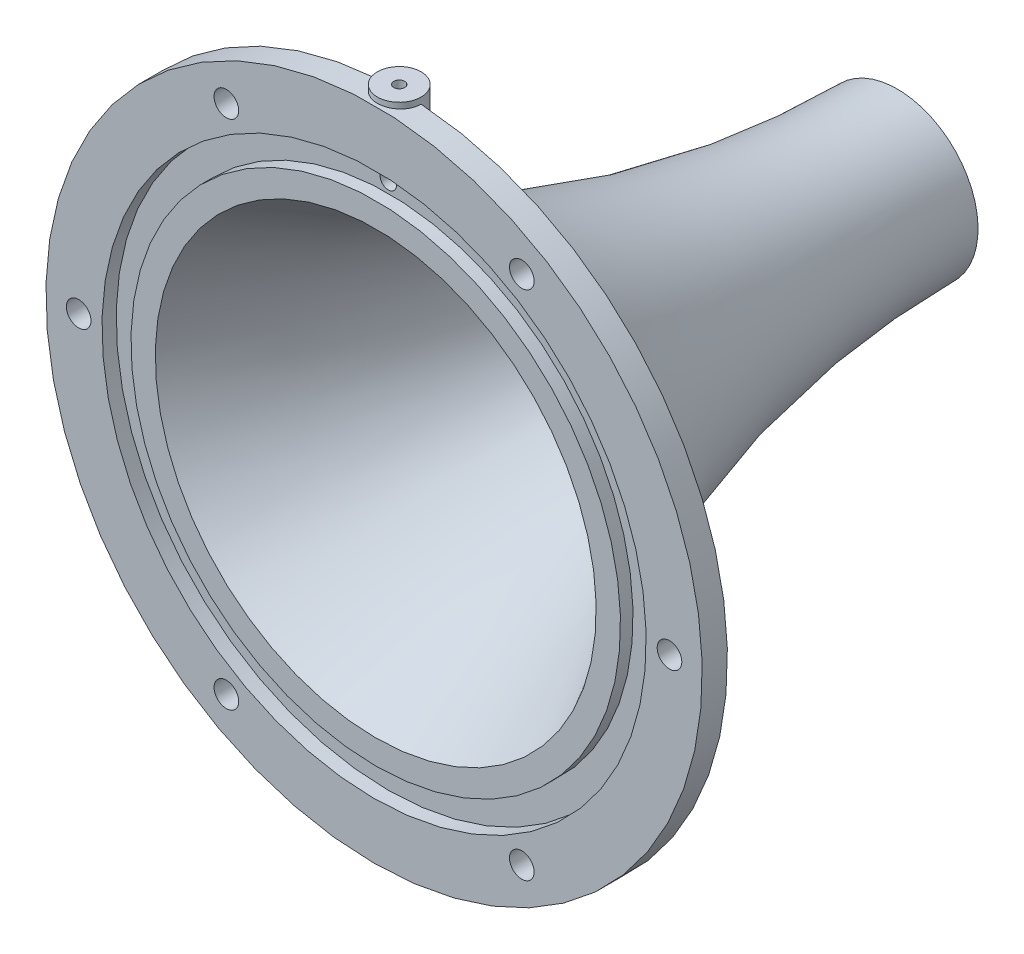
ISO-10303-21;
HEADER;
FILE_DESCRIPTION(('STEP AP214'),'2;1');
FILE_NAME('part.step','',(''),(''),'','','');
FILE_SCHEMA(('AUTOMOTIVE_DESIGN { 1 0 10303 214 1 1 1 1 }'));
ENDSEC;
DATA;
#1=APPLICATION_CONTEXT('core data for automotive mechanical design processes');
#2=APPLICATION_PROTOCOL_DEFINITION('international standard','automotive_design',2000,#1);
#3=PRODUCT_CONTEXT('',#1,'mechanical');
#4=PRODUCT('Part','Part','',(#3));
#5=PRODUCT_RELATED_PRODUCT_CATEGORY('part','',(#4));
#6=PRODUCT_DEFINITION_FORMATION('','',#4);
#7=PRODUCT_DEFINITION_CONTEXT('part definition',#1,'design');
#8=PRODUCT_DEFINITION('design','',#6,#7);
#9=PRODUCT_DEFINITION_SHAPE('','',#8);
#10=(LENGTH_UNIT() NAMED_UNIT(*) SI_UNIT(.MILLI.,.METRE.));
#11=(NAMED_UNIT(*) PLANE_ANGLE_UNIT() SI_UNIT($,.RADIAN.));
#12=(NAMED_UNIT(*) SI_UNIT($,.STERADIAN.) SOLID_ANGLE_UNIT());
#13=UNCERTAINTY_MEASURE_WITH_UNIT(LENGTH_MEASURE(1.E-05),#10,'distance_accuracy_value','');
#14=(GEOMETRIC_REPRESENTATION_CONTEXT(3) GLOBAL_UNCERTAINTY_ASSIGNED_CONTEXT((#13)) GLOBAL_UNIT_ASSIGNED_CONTEXT((#10,
#11,#12)) REPRESENTATION_CONTEXT('',''));
#15=CARTESIAN_POINT('',(0.,0.,0.));
#16=DIRECTION('',(0.,0.,1.));
#17=DIRECTION('',(1.,0.,0.));
#18=AXIS2_PLACEMENT_3D('',#15,#16,#17);
#19=CARTESIAN_POINT('',(3.11633262842919E-13,47.,-4.25000000000002));
#20=DIRECTION('',(0.,1.,0.));
#21=DIRECTION('',(-1.,0.,0.));
#22=AXIS2_PLACEMENT_3D('',#19,#20,#21);
#23=CYLINDRICAL_SURFACE('',#22,1.);
#24=CARTESIAN_POINT('',(4.09394740330526E-13,61.,-4.25000000000002));
#25=DIRECTION('',(0.,1.,0.));
#26=DIRECTION('',(-1.,0.,0.));
#27=AXIS2_PLACEMENT_3D('',#24,#25,#26);
#28=CIRCLE('',#27,1.);
#29=CARTESIAN_POINT('',(-0.999999999999591,61.,-4.25000000000002));
#30=VERTEX_POINT('',#29);
#31=EDGE_CURVE('E100',#30,#30,#28,.T.);
#32=ORIENTED_EDGE('',*,*,#31,.T.);
#33=EDGE_LOOP('',(#32));
#34=FACE_BOUND('',#33,.T.);
#35=DIRECTION('',(0.,1.,0.));
#36=VECTOR('',#35,1.);
#37=CARTESIAN_POINT('',(0.312249899920286,47.,-5.2));
#38=LINE('',#37,#36);
#39=CARTESIAN_POINT('',(0.312249899920295,48.2645090409801,-5.2));
#40=VERTEX_POINT('',#39);
#41=CARTESIAN_POINT('',(0.312249899920286,47.,-5.2));
#42=VERTEX_POINT('',#41);
#43=EDGE_CURVE('E58',#40,#42,#38,.F.);
#44=ORIENTED_EDGE('',*,*,#43,.F.);
#45=CARTESIAN_POINT('',(0.312249899920295,48.2645090409801,-5.2));
#46=CARTESIAN_POINT('',(0.339429131130015,48.2587272483234,-5.19106721556151));
#47=CARTESIAN_POINT('',(0.366069367138822,48.252264916611,-5.18101786271158));
#48=CARTESIAN_POINT('',(0.418112167071895,48.2381697059591,-5.1588352082007));
#49=CARTESIAN_POINT('',(0.443516010642875,48.2305380727019,-5.1467041226239));
#50=CARTESIAN_POINT('',(0.517371581503358,48.2062676755095,-5.10756341100762));
#51=CARTESIAN_POINT('',(0.563851831613718,48.1881671398485,-5.07767706124185));
#52=CARTESIAN_POINT('',(0.650514545487215,48.1498014218964,-5.0114466868769));
#53=CARTESIAN_POINT('',(0.690721276479891,48.1295451175943,-4.97512876755921));
#54=CARTESIAN_POINT('',(0.764793783944427,48.0884495534347,-4.89654026336707));
#55=CARTESIAN_POINT('',(0.7986375661415,48.0676085476949,-4.85424988493833));
#56=CARTESIAN_POINT('',(0.86257720134162,48.0252045811346,-4.75948259884957));
#57=CARTESIAN_POINT('',(0.891890965614326,48.0038008004243,-4.70640059428819));
#58=CARTESIAN_POINT('',(0.940807440682571,47.9660616521264,-4.59435951943732));
#59=CARTESIAN_POINT('',(0.960446486497765,47.9497074079348,-4.53542345340502));
#60=CARTESIAN_POINT('',(0.984018988756187,47.9295631538378,-4.43304548253065));
#61=CARTESIAN_POINT('',(0.990978413505443,47.9234198049856,-4.39076264043626));
#62=CARTESIAN_POINT('',(0.999393306873638,47.9159607281361,-4.30524865317566));
#63=CARTESIAN_POINT('',(1.00085513268926,47.9146394241774,-4.26201866149978));
#64=CARTESIAN_POINT('',(0.998180501694661,47.9170286656982,-4.1758803518083));
#65=CARTESIAN_POINT('',(0.994043862852669,47.9207393747914,-4.13297204429774));
#66=CARTESIAN_POINT('',(0.980448018815304,47.9326224303053,-4.04862283178369));
#67=CARTESIAN_POINT('',(0.970981356266491,47.9408010273686,-4.00718406938978));
#68=CARTESIAN_POINT('',(0.943769474548862,47.9634276932872,-3.91499593542304));
#69=CARTESIAN_POINT('',(0.924425688527903,47.9790027536465,-3.86499986539942));
#70=CARTESIAN_POINT('',(0.878650580734091,48.0134248937674,-3.76960080759542));
#71=CARTESIAN_POINT('',(0.85220921618486,48.032276596414,-3.72420445457389));
#72=CARTESIAN_POINT('',(0.792353832748401,48.0715274584364,-3.63763333862915));
#73=CARTESIAN_POINT('',(0.758821541362462,48.0919485555119,-3.5965505714794));
#74=CARTESIAN_POINT('',(0.685528032516043,48.1322102837797,-3.52002819528285));
#75=CARTESIAN_POINT('',(0.645765555927867,48.1520507966712,-3.48458972988182));
#76=CARTESIAN_POINT('',(0.554899862045546,48.1919484678116,-3.41589492767503));
#77=CARTESIAN_POINT('',(0.502995611991148,48.2117044646022,-3.38350737394361));
#78=CARTESIAN_POINT('',(0.39278622750259,48.2461742130727,-3.32831620009406));
#79=CARTESIAN_POINT('',(0.334488972569568,48.2608940816597,-3.30550094573106));
#80=CARTESIAN_POINT('',(0.22131802490095,48.2819182257329,-3.27326353785595));
#81=CARTESIAN_POINT('',(0.166992333140664,48.2890708118812,-3.26248090007744));
#82=CARTESIAN_POINT('',(0.0568702512554773,48.2973030547209,-3.25008719867515));
#83=CARTESIAN_POINT('',(0.00107547948069877,48.2983891344525,-3.24846643470464));
#84=CARTESIAN_POINT('',(-0.10192810790048,48.2946627669567,-3.25406327138851));
#85=CARTESIAN_POINT('',(-0.149239451532032,48.2906595078044,-3.26006825169875));
#86=CARTESIAN_POINT('',(-0.242005610189204,48.2784568970987,-3.27857321359998));
#87=CARTESIAN_POINT('',(-0.287460209609515,48.2702570597254,-3.29107394717898));
#88=CARTESIAN_POINT('',(-0.376151268655612,48.2501637651787,-3.3222304184781));
#89=CARTESIAN_POINT('',(-0.419341774893449,48.2382144105505,-3.34097958905729));
#90=CARTESIAN_POINT('',(-0.501998423589624,48.2115423022087,-3.38387753227945));
#91=CARTESIAN_POINT('',(-0.541463788321321,48.1968189712645,-3.40802742894352));
#92=CARTESIAN_POINT('',(-0.621503193572179,48.1633375726543,-3.46484324292302));
#93=CARTESIAN_POINT('',(-0.661449342720923,48.1443033170389,-3.49822972755308));
#94=CARTESIAN_POINT('',(-0.735549561683111,48.1053157948276,-3.57054908910779));
#95=CARTESIAN_POINT('',(-0.769693259531983,48.0853609619556,-3.60949167382677));
#96=CARTESIAN_POINT('',(-0.836292320786411,48.0433141885819,-3.698506233676));
#97=CARTESIAN_POINT('',(-0.867767994760641,48.0213372939862,-3.74937287981356));
#98=CARTESIAN_POINT('',(-0.921557828450619,47.9813692999093,-3.85714338666404));
#99=CARTESIAN_POINT('',(-0.943893699505366,47.9633688020171,-3.91403253128541));
#100=CARTESIAN_POINT('',(-0.97280948904171,47.9392454652403,-4.01447210623816));
#101=CARTESIAN_POINT('',(-0.982120484046534,47.931173066213,-4.05676489724562));
#102=CARTESIAN_POINT('',(-0.995184540809722,47.9197263908964,-4.14279399674645));
#103=CARTESIAN_POINT('',(-0.998946628039302,47.9163444859086,-4.18652784257669));
#104=CARTESIAN_POINT('',(-1.00066992897141,47.9148043267936,-4.27431052310508));
#105=CARTESIAN_POINT('',(-0.99861736516637,47.9166584791942,-4.31835985883185));
#106=CARTESIAN_POINT('',(-0.988831822566293,47.9253101301408,-4.40534918998823));
#107=CARTESIAN_POINT('',(-0.98109150462051,47.9321140154241,-4.44828767786996));
#108=CARTESIAN_POINT('',(-0.958188311089447,47.951554028771,-4.5408724069241));
#109=CARTESIAN_POINT('',(-0.941801291013707,47.9651196900877,-4.59001517858134));
#110=CARTESIAN_POINT('',(-0.902251884525741,47.9959377219145,-4.68423795256894));
#111=CARTESIAN_POINT('',(-0.879080139267191,48.013195175964,-4.72931222970512));
#112=CARTESIAN_POINT('',(-0.826181536914572,48.0497572823741,-4.81571569887383));
#113=CARTESIAN_POINT('',(-0.796347078372984,48.0690924714234,-4.85696556335929));
#114=CARTESIAN_POINT('',(-0.730806457519254,48.1078542198448,-4.93446855323348));
#115=CARTESIAN_POINT('',(-0.695098820106323,48.127280800977,-4.97072041911525));
#116=CARTESIAN_POINT('',(-0.616402170640292,48.1655989429746,-5.0392367690365));
#117=CARTESIAN_POINT('',(-0.573154436716379,48.1844251710129,-5.07124233844544));
#118=CARTESIAN_POINT('',(-0.481226185532255,48.2189212428746,-5.12825217263113));
#119=CARTESIAN_POINT('',(-0.432561257653752,48.2345997976864,-5.15327583644688));
#120=CARTESIAN_POINT('',(-0.35896753488144,48.2539766136045,-5.18367689322861));
#121=CARTESIAN_POINT('',(-0.335803737915078,48.2595037466069,-5.19226383427425));
#122=CARTESIAN_POINT('',(-0.312249899919655,48.2645090409802,-5.2));
#123=B_SPLINE_CURVE_WITH_KNOTS('',3,(#45,#46,#47,#48,#49,#50,#51,#52,#53,#54,#55,#56,#57,#58,
#59,#60,#61,#62,#63,#64,#65,#66,#67,#68,#69,#70,#71,#72,#73,#74,#75,#76,#77,#78,#79,#80,#81,#82,
#83,#84,#85,#86,#87,#88,#89,#90,#91,#92,#93,#94,#95,#96,#97,#98,#99,#100,#101,#102,#103,#104,
#105,#106,#107,#108,#109,#110,#111,#112,#113,#114,#115,#116,#117,#118,#119,#120,#121,#122),
.UNSPECIFIED.,.F.,.F.,(4,2,2,2,2,2,2,2,2,2,2,2,2,2,2,2,2,2,2,2,2,2,2,2,2,2,2,2,2,2,2,2,2,2,2,2,
2,2,4),(0.,0.0874862542340177,0.174879947287562,0.348441157401667,0.521313400112509,
0.694772630612664,0.886690536272744,1.07788206020984,1.2071924640183,1.33635329254996,
1.46551832079362,1.59486451736093,1.76144162108205,1.92825567834189,2.09810932185944,
2.26799733737974,2.45976423488374,2.65129737748878,2.81780365154808,2.98413360015436,
3.12703814697667,3.26995924098757,3.41512123494478,3.5603134687704,3.72597206508964,
3.8919237329724,4.08218090216388,4.27198345992224,4.40359689666968,4.53499602308367,
4.66670675299561,4.79858773395582,4.95837793074912,5.11838958887202,5.28120098685205,
5.44405333897039,5.61436988055442,5.78420837964017,5.86007593660947),.UNSPECIFIED.);
#124=CARTESIAN_POINT('',(-0.312249899919654,48.2645090409802,-5.2));
#125=VERTEX_POINT('',#124);
#126=EDGE_CURVE('E11',#40,#125,#123,.T.);
#127=ORIENTED_EDGE('',*,*,#126,.T.);
#128=DIRECTION('',(0.,1.,0.));
#129=VECTOR('',#128,1.);
#130=CARTESIAN_POINT('',(-0.312249899919663,47.,-5.2));
#131=LINE('',#130,#129);
#132=CARTESIAN_POINT('',(-0.312249899919663,47.,-5.2));
#133=VERTEX_POINT('',#132);
#134=EDGE_CURVE('E91',#133,#125,#131,.T.);
#135=ORIENTED_EDGE('',*,*,#134,.F.);
#136=CARTESIAN_POINT('',(3.11633262842919E-13,47.,-4.25000000000002));
#137=DIRECTION('',(0.,1.,0.));
#138=DIRECTION('',(-1.,0.,0.));
#139=AXIS2_PLACEMENT_3D('',#136,#137,#138);
#140=CIRCLE('',#139,1.);
#141=EDGE_CURVE('E96',#42,#133,#140,.T.);
#142=ORIENTED_EDGE('',*,*,#141,.F.);
#143=EDGE_LOOP('',(#44,#127,#135,#142));
#144=FACE_BOUND('',#143,.T.);
#145=ADVANCED_FACE('F37',(#34,#144),#23,.F.);
#146=CARTESIAN_POINT('',(3.11633262842919E-13,47.,-4.25000000000002));
#147=DIRECTION('',(0.,1.,0.));
#148=DIRECTION('',(-1.,0.,0.));
#149=AXIS2_PLACEMENT_3D('',#146,#147,#148);
#150=PLANE('',#149);
#151=ORIENTED_EDGE('',*,*,#141,.T.);
#152=DIRECTION('',(1.,0.,0.));
#153=VECTOR('',#152,1.);
#154=CARTESIAN_POINT('',(3.11633262842919E-13,47.,-5.2));
#155=LINE('',#154,#153);
#156=EDGE_CURVE('E51',#133,#42,#155,.T.);
#157=ORIENTED_EDGE('',*,*,#156,.T.);
#158=EDGE_LOOP('',(#151,#157));
#159=FACE_BOUND('',#158,.T.);
#160=ADVANCED_FACE('F165',(#159),#150,.T.);
#161=CARTESIAN_POINT('',(0.,0.,-95.3));
#162=DIRECTION('',(0.,0.,1.));
#163=DIRECTION('',(0.,-1.,0.));
#164=AXIS2_PLACEMENT_3D('',#161,#162,#163);
#165=TOROIDAL_SURFACE('',#164,189.75,175.);
#166=CARTESIAN_POINT('',(0.,0.,-95.3));
#167=DIRECTION('',(0.,0.,1.));
#168=DIRECTION('',(0.,-1.,0.));
#169=AXIS2_PLACEMENT_3D('',#166,#167,#168);
#170=CIRCLE('',#169,14.75);
#171=CARTESIAN_POINT('',(0.,-14.7499999999999,-95.3));
#172=VERTEX_POINT('',#171);
#173=EDGE_CURVE('E162',#172,#172,#170,.T.);
#174=ORIENTED_EDGE('',*,*,#173,.T.);
#175=EDGE_LOOP('',(#174));
#176=FACE_BOUND('',#175,.T.);
#177=CARTESIAN_POINT('',(-3.99999999499974,40.1024816452544,-4.24980000000001));
#178=CARTESIAN_POINT('',(-4.00000963744949,40.0135475176984,-4.39502824331708));
#179=CARTESIAN_POINT('',(-3.99210386935413,39.9253941711124,-4.54079049451183));
#180=CARTESIAN_POINT('',(-3.960127705231,39.7513775875862,-4.8321430809879));
#181=CARTESIAN_POINT('',(-3.93603762443775,39.6655172720148,-4.97773299037343));
#182=CARTESIAN_POINT('',(-3.87114389266572,39.4964798301795,-5.26809566240462));
#183=CARTESIAN_POINT('',(-3.83023092578023,39.413324166009,-5.41285668067751));
#184=CARTESIAN_POINT('',(-3.73145475836282,39.2512053423876,-5.69883044296967));
#185=CARTESIAN_POINT('',(-3.67360091374282,39.1722398971688,-5.84004509891847));
#186=CARTESIAN_POINT('',(-3.55086910979763,39.0308963344556,-6.09616921386422));
#187=CARTESIAN_POINT('',(-3.48836897426726,38.9678134460936,-6.21183221781345));
#188=CARTESIAN_POINT('',(-3.35114611679119,38.8458271634979,-6.43799107030654));
#189=CARTESIAN_POINT('',(-3.27642587621314,38.7869229242381,-6.54848796201621));
#190=CARTESIAN_POINT('',(-3.11525713076611,38.6740171597809,-6.76258141416236));
#191=CARTESIAN_POINT('',(-3.02884949710627,38.6199995979725,-6.86620022436661));
#192=CARTESIAN_POINT('',(-2.84454091717301,38.517164753476,-7.06549242574892));
#193=CARTESIAN_POINT('',(-2.74664222743624,38.468346453371,-7.16116737061051));
#194=CARTESIAN_POINT('',(-2.55462025294791,38.3828909918093,-7.33024248309115));
#195=CARTESIAN_POINT('',(-2.46191581152338,38.3455071709691,-7.40488031963515));
#196=CARTESIAN_POINT('',(-2.26910500669929,38.275215812908,-7.54627787247685));
#197=CARTESIAN_POINT('',(-2.16899993964635,38.2423074945802,-7.61303896322827));
#198=CARTESIAN_POINT('',(-1.96210009941636,38.1812176470432,-7.73780131141317));
#199=CARTESIAN_POINT('',(-1.85530511668707,38.1530362660004,-7.79580229425425));
#200=CARTESIAN_POINT('',(-1.63590337207248,38.1016247027448,-7.90221571691326));
#201=CARTESIAN_POINT('',(-1.52329723133129,38.0783939927198,-7.95062917885892));
#202=CARTESIAN_POINT('',(-1.30689731558645,38.0395109013124,-8.03203135361252));
#203=CARTESIAN_POINT('',(-1.20363576456631,38.0232872532581,-8.06616700927886));
#204=CARTESIAN_POINT('',(-0.994112800047229,37.9949238284287,-8.12603041709323));
#205=CARTESIAN_POINT('',(-0.887850440165085,37.9827853559688,-8.15175548383291));
#206=CARTESIAN_POINT('',(-0.673291694768126,37.9626843924314,-8.19444329281246));
#207=CARTESIAN_POINT('',(-0.564997221649944,37.9547181608289,-8.21141388346736));
#208=CARTESIAN_POINT('',(-0.347113242228745,37.9429916659464,-8.23641943777181));
#209=CARTESIAN_POINT('',(-0.237523290085358,37.9392328959296,-8.24445122896106));
#210=CARTESIAN_POINT('',(-0.0247585620788956,37.9360504123668,-8.25125097345531));
#211=CARTESIAN_POINT('',(0.0783956388095898,37.9363739745859,-8.25055899015678));
#212=CARTESIAN_POINT('',(0.284301117511374,37.9407480726853,-8.24121497209619));
#213=CARTESIAN_POINT('',(0.387052242033728,37.9447999100757,-8.23256015757551));
#214=CARTESIAN_POINT('',(0.59132040635832,37.9566079800307,-8.20738864347703));
#215=CARTESIAN_POINT('',(0.692838012873869,37.9643624399964,-8.19087570592126));
#216=CARTESIAN_POINT('',(0.894005077691318,37.9835361161893,-8.15016561577753));
#217=CARTESIAN_POINT('',(0.993653827587539,37.9949566935149,-8.12596560929082));
#218=CARTESIAN_POINT('',(1.18957475748369,38.02129597113,-8.0703655745267));
#219=CARTESIAN_POINT('',(1.28586759540692,38.0361859082193,-8.03902479272145));
#220=CARTESIAN_POINT('',(1.47529293509005,38.0694306021523,-7.9693700115747));
#221=CARTESIAN_POINT('',(1.5684242943937,38.0877865961183,-7.93105352260481));
#222=CARTESIAN_POINT('',(1.84213094262695,38.1479092753655,-7.80621531162811));
#223=CARTESIAN_POINT('',(2.01719704969778,38.1947546316695,-7.709753605649));
#224=CARTESIAN_POINT('',(2.35486628533744,38.3030212086234,-7.48988275835803));
#225=CARTESIAN_POINT('',(2.51670959661396,38.3649427566483,-7.36556383702431));
#226=CARTESIAN_POINT('',(2.81698932429011,38.5009120339128,-7.09695709188039));
#227=CARTESIAN_POINT('',(2.95542109366936,38.5749621648592,-6.95266531391554));
#228=CARTESIAN_POINT('',(3.21740272924201,38.7401815264837,-6.6361962427635));
#229=CARTESIAN_POINT('',(3.33878087700481,38.8322593076615,-6.46270029057792));
#230=CARTESIAN_POINT('',(3.55097378278342,39.0267293389109,-6.10316749144803));
#231=CARTESIAN_POINT('',(3.64176207343534,39.1291304220432,-5.91711995062368));
#232=CARTESIAN_POINT('',(3.80156009147332,39.3546291860247,-5.51503609724912));
#233=CARTESIAN_POINT('',(3.86673464196538,39.4787431386607,-5.29805201271342));
#234=CARTESIAN_POINT('',(3.95941988210062,39.7340375433984,-4.86065395273067));
#235=CARTESIAN_POINT('',(3.98698116359712,39.865208256295,-4.64024498856947));
#236=CARTESIAN_POINT('',(3.99879465754128,40.0329747196054,-4.3635910465297));
#237=CARTESIAN_POINT('',(4.00000436475232,40.0676734798825,-4.30664755146881));
#238=CARTESIAN_POINT('',(3.99999999500026,40.1024816452543,-4.24980000000002));
#239=B_SPLINE_CURVE_WITH_KNOTS('',3,(#177,#178,#179,#180,#181,#182,#183,#184,#185,#186,#187,
#188,#189,#190,#191,#192,#193,#194,#195,#196,#197,#198,#199,#200,#201,#202,#203,#204,#205,#206,
#207,#208,#209,#210,#211,#212,#213,#214,#215,#216,#217,#218,#219,#220,#221,#222,#223,#224,#225,
#226,#227,#228,#229,#230,#231,#232,#233,#234,#235,#236,#237,#238),.UNSPECIFIED.,.F.,.F.,(4,2,2,
2,2,2,2,2,2,2,2,2,2,2,2,2,2,2,2,2,2,2,2,2,2,2,2,2,2,2,4),(0.,0.510772955853655,1.02216828552887,
1.53694056196125,2.05142908037974,2.48827064973139,2.92502362559357,3.36028695355811,
3.79546494997539,4.16919433196017,4.54285840323803,4.91653418487769,5.29017010738772,
5.61962971536954,5.9491944136752,6.27846314048156,6.60784869048986,6.91694854523677,
7.22615634514863,7.5352162626608,7.8443910560308,8.15108847825462,8.45789557607625,
9.07095541377363,9.70809995475889,10.3453708162334,11.0352462541785,11.7257170716615,
12.4976821471123,13.2686078615723,13.4686354905664),.UNSPECIFIED.);
#240=CARTESIAN_POINT('',(-3.99999999999974,40.1023591920638,-4.25000000000002));
#241=VERTEX_POINT('',#240);
#242=CARTESIAN_POINT('',(4.00000000000026,40.1023591920637,-4.25000000000002));
#243=VERTEX_POINT('',#242);
#244=EDGE_CURVE('E105',#241,#243,#239,.T.);
#245=ORIENTED_EDGE('',*,*,#244,.T.);
#246=CARTESIAN_POINT('',(0.,0.,-4.25000000000002));
#247=DIRECTION('',(0.,0.,1.));
#248=DIRECTION('',(0.,-1.,0.));
#249=AXIS2_PLACEMENT_3D('',#246,#247,#248);
#250=CIRCLE('',#249,40.3013549743591);
#251=EDGE_CURVE('E111',#241,#243,#250,.T.);
#252=ORIENTED_EDGE('',*,*,#251,.F.);
#253=EDGE_LOOP('',(#245,#252));
#254=FACE_BOUND('',#253,.T.);
#255=ADVANCED_FACE('F39',(#176,#254),#165,.F.);
#256=CARTESIAN_POINT('',(0.,0.,95.3));
#257=DIRECTION('',(0.,0.,1.));
#258=DIRECTION('',(0.,-1.,0.));
#259=AXIS2_PLACEMENT_3D('',#256,#257,#258);
#260=CYLINDRICAL_SURFACE('',#259,60.);
#261=CARTESIAN_POINT('',(0.,0.,0.350000000000003));
#262=DIRECTION('',(0.,0.,1.));
#263=DIRECTION('',(0.,-1.,0.));
#264=AXIS2_PLACEMENT_3D('',#261,#262,#263);
#265=CIRCLE('',#264,60.);
#266=CARTESIAN_POINT('',(0.,-60.,0.349999999999992));
#267=VERTEX_POINT('',#266);
#268=EDGE_CURVE('E141',#267,#267,#265,.T.);
#269=ORIENTED_EDGE('',*,*,#268,.F.);
#270=EDGE_LOOP('',(#269));
#271=FACE_BOUND('',#270,.T.);
#272=CARTESIAN_POINT('',(4.0000000000004,59.866518188383,-4.25000000000002));
#273=CARTESIAN_POINT('',(4.00001092336467,59.8665150977074,-4.13762924864768));
#274=CARTESIAN_POINT('',(3.99526485467711,59.8668345070878,-4.02526377850473));
#275=CARTESIAN_POINT('',(3.97634329223595,59.8680954990405,-3.80133919553325));
#276=CARTESIAN_POINT('',(3.96216832751871,59.869037046706,-3.68978003781912));
#277=CARTESIAN_POINT('',(3.9244884789045,59.8715185075693,-3.46833903374687));
#278=CARTESIAN_POINT('',(3.90099101173511,59.873057945082,-3.35845592596085));
#279=CARTESIAN_POINT('',(3.84485871305017,59.8766886602677,-3.1410911151613));
#280=CARTESIAN_POINT('',(3.81222397660672,59.878779932199,-3.03360938717428));
#281=CARTESIAN_POINT('',(3.70088516840696,59.8858002398912,-2.71581389081875));
#282=CARTESIAN_POINT('',(3.60872892092486,59.8914769987991,-2.51004708895492));
#283=CARTESIAN_POINT('',(3.39131652816687,59.904179699337,-2.11705171332788));
#284=CARTESIAN_POINT('',(3.2660657658625,59.9112054215012,-1.92982013152997));
#285=CARTESIAN_POINT('',(2.98576557566882,59.9258281064001,-1.57872668472122));
#286=CARTESIAN_POINT('',(2.83067447026718,59.9334258589383,-1.41489807053413));
#287=CARTESIAN_POINT('',(2.49517196123315,59.9483298830124,-1.11556595144782));
#288=CARTESIAN_POINT('',(2.31475670848509,59.9556361100209,-0.980066760256454));
#289=CARTESIAN_POINT('',(1.93354101281284,59.9691401724522,-0.741145257905167));
#290=CARTESIAN_POINT('',(1.73272253713338,59.9753370137835,-0.637751655400136));
#291=CARTESIAN_POINT('',(1.31654086612462,59.9859150333624,-0.466168795419626));
#292=CARTESIAN_POINT('',(1.10117873512062,59.9902963443059,-0.397976964978888));
#293=CARTESIAN_POINT('',(0.662350191717232,59.9967444805519,-0.298820754120794));
#294=CARTESIAN_POINT('',(0.438896265059542,59.9988147268763,-0.267801343112152));
#295=CARTESIAN_POINT('',(-0.0100611930209005,60.0004190226816,-0.243700645310293));
#296=CARTESIAN_POINT('',(-0.235564749142535,59.9999530415594,-0.250619816299367));
#297=CARTESIAN_POINT('',(-0.681834905581149,59.9965401486558,-0.302155636842139));
#298=CARTESIAN_POINT('',(-0.902608504499605,59.9935972055543,-0.34671198313967));
#299=CARTESIAN_POINT('',(-1.33353518370801,59.9855662413165,-0.472164309635936));
#300=CARTESIAN_POINT('',(-1.54368824289371,59.9804782159181,-0.553060362042782));
#301=CARTESIAN_POINT('',(-1.94760575845628,59.9687229748465,-0.748963100256802));
#302=CARTESIAN_POINT('',(-2.14135660531328,59.9620544648837,-0.863997762408048));
#303=CARTESIAN_POINT('',(-2.50681476867372,59.9478888380543,-1.12489611967125));
#304=CARTESIAN_POINT('',(-2.67852283656228,59.9403917494481,-1.27075876348293));
#305=CARTESIAN_POINT('',(-2.99534678432929,59.9253965465278,-1.58945366911188));
#306=CARTESIAN_POINT('',(-3.14041387852192,59.9178984550061,-1.76233435677594));
#307=CARTESIAN_POINT('',(-3.39955748366665,59.9037555756149,-2.13019621420649));
#308=CARTESIAN_POINT('',(-3.51362433329249,59.8971110541028,-2.32518424702852));
#309=CARTESIAN_POINT('',(-3.65893575736674,59.8883504434396,-2.62983656107757));
#310=CARTESIAN_POINT('',(-3.70310203624011,59.8856294201262,-2.73351161395007));
#311=CARTESIAN_POINT('',(-3.78253599500143,59.8806647667633,-2.94421567022846));
#312=CARTESIAN_POINT('',(-3.81780703044943,59.8784209567444,-3.05124339172434));
#313=CARTESIAN_POINT('',(-3.87916063623788,59.8744774997893,-3.26777317527946));
#314=CARTESIAN_POINT('',(-3.90525320983634,59.8727772606212,-3.37727240430988));
#315=CARTESIAN_POINT('',(-3.94811200967428,59.8699663806075,-3.59804574777966));
#316=CARTESIAN_POINT('',(-3.96488279650898,59.8688554514598,-3.70931896685165));
#317=CARTESIAN_POINT('',(-3.98462469011343,59.8675439926369,-3.89235724107851));
#318=CARTESIAN_POINT('',(-3.99039402904053,59.8671594495815,-3.96383115633944));
#319=CARTESIAN_POINT('',(-3.99807894242917,59.8666465522146,-4.10686755689202));
#320=CARTESIAN_POINT('',(-4.00000090926314,59.8665177729567,-4.17842969726671));
#321=CARTESIAN_POINT('',(-3.9999999999996,59.8665181883831,-4.25000000000002));
#322=B_SPLINE_CURVE_WITH_KNOTS('',3,(#272,#273,#274,#275,#276,#277,#278,#279,#280,#281,#282,
#283,#284,#285,#286,#287,#288,#289,#290,#291,#292,#293,#294,#295,#296,#297,#298,#299,#300,#301,
#302,#303,#304,#305,#306,#307,#308,#309,#310,#311,#312,#313,#314,#315,#316,#317,#318,#319,#320,
#321),.UNSPECIFIED.,.F.,.F.,(4,2,2,2,2,2,2,2,2,2,2,2,2,2,2,2,2,2,2,2,2,2,2,2,4),(0.,
0.337002124658695,0.673985342401825,1.01070100140347,1.34741315705265,2.0205287424913,
2.69353490998218,3.36748796840783,4.04154357472722,4.71620019391752,5.3908074941726,
6.06441485729448,6.73803034845342,7.41056859812857,8.08310818416377,8.75620044064862,
9.42926974694714,10.1035595665552,10.7780592904055,11.115899938646,11.4536129517061,
11.7909567554068,12.1281353712747,12.3431617073667,12.5578304817106),.UNSPECIFIED.);
#323=CARTESIAN_POINT('',(4.0000000000004,59.866518188383,-4.25000000000002));
#324=VERTEX_POINT('',#323);
#325=CARTESIAN_POINT('',(-3.9999999999996,59.8665181883831,-4.25000000000002));
#326=VERTEX_POINT('',#325);
#327=EDGE_CURVE('E112',#324,#326,#322,.T.);
#328=ORIENTED_EDGE('',*,*,#327,.T.);
#329=CARTESIAN_POINT('',(0.,0.,-4.25000000000002));
#330=DIRECTION('',(0.,0.,1.));
#331=DIRECTION('',(0.,-1.,0.));
#332=AXIS2_PLACEMENT_3D('',#329,#330,#331);
#333=CIRCLE('',#332,60.);
#334=EDGE_CURVE('E138',#326,#324,#333,.T.);
#335=ORIENTED_EDGE('',*,*,#334,.T.);
#336=EDGE_LOOP('',(#328,#335));
#337=FACE_BOUND('',#336,.T.);
#338=ADVANCED_FACE('F172',(#271,#337),#260,.T.);
#339=CARTESIAN_POINT('',(0.,40.3013549743591,-4.25));
#340=DIRECTION('',(0.,0.,1.));
#341=DIRECTION('',(0.,-1.,0.));
#342=AXIS2_PLACEMENT_3D('',#339,#340,#341);
#343=PLANE('',#342);
#344=CARTESIAN_POINT('',(-26.9999999999996,46.7653718043599,-4.25));
#345=DIRECTION('',(0.,0.,1.));
#346=DIRECTION('',(0.,-1.,0.));
#347=AXIS2_PLACEMENT_3D('',#344,#345,#346);
#348=CIRCLE('',#347,2.25000000000014);
#349=CARTESIAN_POINT('',(-26.9999999999996,44.5153718043598,-4.25));
#350=VERTEX_POINT('',#349);
#351=EDGE_CURVE('E92',#350,#350,#348,.T.);
#352=ORIENTED_EDGE('',*,*,#351,.T.);
#353=EDGE_LOOP('',(#352));
#354=FACE_BOUND('',#353,.T.);
#355=CARTESIAN_POINT('',(-54.,3.85777285578169E-13,-4.25000000000002));
#356=DIRECTION('',(0.,0.,1.));
#357=DIRECTION('',(0.,-1.,0.));
#358=AXIS2_PLACEMENT_3D('',#355,#356,#357);
#359=CIRCLE('',#358,2.25000000000014);
#360=CARTESIAN_POINT('',(-54.,-2.24999999999975,-4.25000000000002));
#361=VERTEX_POINT('',#360);
#362=EDGE_CURVE('E227',#361,#361,#359,.T.);
#363=ORIENTED_EDGE('',*,*,#362,.T.);
#364=EDGE_LOOP('',(#363));
#365=FACE_BOUND('',#364,.T.);
#366=CARTESIAN_POINT('',(-27.0000000000002,-46.7653718043596,-4.25000000000002));
#367=DIRECTION('',(0.,0.,1.));
#368=DIRECTION('',(0.,-1.,0.));
#369=AXIS2_PLACEMENT_3D('',#366,#367,#368);
#370=CIRCLE('',#369,2.25000000000013);
#371=CARTESIAN_POINT('',(-27.0000000000002,-49.0153718043597,-4.25000000000002));
#372=VERTEX_POINT('',#371);
#373=EDGE_CURVE('E218',#372,#372,#370,.T.);
#374=ORIENTED_EDGE('',*,*,#373,.T.);
#375=EDGE_LOOP('',(#374));
#376=FACE_BOUND('',#375,.T.);
#377=CARTESIAN_POINT('',(54.,0.,-4.25000000000002));
#378=DIRECTION('',(0.,0.,1.));
#379=DIRECTION('',(0.,-1.,0.));
#380=AXIS2_PLACEMENT_3D('',#377,#378,#379);
#381=CIRCLE('',#380,2.25000000000013);
#382=CARTESIAN_POINT('',(54.,-2.25000000000014,-4.25000000000002));
#383=VERTEX_POINT('',#382);
#384=EDGE_CURVE('E214',#383,#383,#381,.T.);
#385=ORIENTED_EDGE('',*,*,#384,.T.);
#386=EDGE_LOOP('',(#385));
#387=FACE_BOUND('',#386,.T.);
#388=CARTESIAN_POINT('',(27.0000000000006,46.7653718043594,-4.25));
#389=DIRECTION('',(0.,0.,1.));
#390=DIRECTION('',(0.,-1.,0.));
#391=AXIS2_PLACEMENT_3D('',#388,#389,#390);
#392=CIRCLE('',#391,2.25000000000014);
#393=CARTESIAN_POINT('',(27.0000000000006,44.5153718043592,-4.25));
#394=VERTEX_POINT('',#393);
#395=EDGE_CURVE('E212',#394,#394,#392,.T.);
#396=ORIENTED_EDGE('',*,*,#395,.T.);
#397=EDGE_LOOP('',(#396));
#398=FACE_BOUND('',#397,.T.);
#399=CARTESIAN_POINT('',(26.9999999999999,-46.7653718043598,-4.25000000000002));
#400=DIRECTION('',(0.,0.,1.));
#401=DIRECTION('',(0.,-1.,0.));
#402=AXIS2_PLACEMENT_3D('',#399,#400,#401);
#403=CIRCLE('',#402,2.25000000000013);
#404=CARTESIAN_POINT('',(26.9999999999999,-49.0153718043599,-4.25000000000002));
#405=VERTEX_POINT('',#404);
#406=EDGE_CURVE('E215',#405,#405,#403,.T.);
#407=ORIENTED_EDGE('',*,*,#406,.T.);
#408=EDGE_LOOP('',(#407));
#409=FACE_BOUND('',#408,.T.);
#410=DIRECTION('',(0.,1.,0.));
#411=VECTOR('',#410,1.);
#412=CARTESIAN_POINT('',(3.99999999999956,-60.002,-4.25000000000002));
#413=LINE('',#412,#411);
#414=EDGE_CURVE('E121',#243,#324,#413,.T.);
#415=ORIENTED_EDGE('',*,*,#414,.T.);
#416=ORIENTED_EDGE('',*,*,#334,.F.);
#417=DIRECTION('',(0.,1.,0.));
#418=VECTOR('',#417,1.);
#419=CARTESIAN_POINT('',(-4.00000000000044,-60.0019999999999,-4.25000000000002));
#420=LINE('',#419,#418);
#421=EDGE_CURVE('E66',#326,#241,#420,.F.);
#422=ORIENTED_EDGE('',*,*,#421,.T.);
#423=ORIENTED_EDGE('',*,*,#251,.T.);
#424=EDGE_LOOP('',(#415,#416,#422,#423));
#425=FACE_BOUND('',#424,.T.);
#426=ADVANCED_FACE('F233',(#354,#365,#376,#387,#398,#409,#425),#343,.F.);
#427=CARTESIAN_POINT('',(0.,14.75,-95.3));
#428=DIRECTION('',(0.,0.,1.));
#429=DIRECTION('',(0.,-1.,0.));
#430=AXIS2_PLACEMENT_3D('',#427,#428,#429);
#431=PLANE('',#430);
#432=ORIENTED_EDGE('',*,*,#173,.F.);
#433=EDGE_LOOP('',(#432));
#434=FACE_BOUND('',#433,.T.);
#435=CARTESIAN_POINT('',(0.,0.,-95.3));
#436=DIRECTION('',(0.,0.,1.));
#437=DIRECTION('',(0.,-1.,0.));
#438=AXIS2_PLACEMENT_3D('',#435,#436,#437);
#439=CIRCLE('',#438,12.75);
#440=CARTESIAN_POINT('',(0.,-12.75,-95.3));
#441=VERTEX_POINT('',#440);
#442=EDGE_CURVE('E159',#441,#441,#439,.T.);
#443=ORIENTED_EDGE('',*,*,#442,.T.);
#444=EDGE_LOOP('',(#443));
#445=FACE_BOUND('',#444,.T.);
#446=ADVANCED_FACE('F237',(#434,#445),#431,.F.);
#447=CARTESIAN_POINT('',(0.,0.,-94.2097401100893));
#448=DIRECTION('',(0.,0.,1.));
#449=DIRECTION('',(0.,-1.,0.));
#450=AXIS2_PLACEMENT_3D('',#447,#448,#449);
#451=TOROIDAL_SURFACE('',#450,187.74660377668,175.);
#452=ORIENTED_EDGE('',*,*,#442,.F.);
#453=EDGE_LOOP('',(#452));
#454=FACE_BOUND('',#453,.T.);
#455=CARTESIAN_POINT('',(0.,0.,0.0500000000000084));
#456=DIRECTION('',(0.,0.,1.));
#457=DIRECTION('',(0.,-1.,0.));
#458=AXIS2_PLACEMENT_3D('',#455,#456,#457);
#459=CIRCLE('',#458,40.3013549743591);
#460=CARTESIAN_POINT('',(0.,-40.3013549743591,0.050000000000001));
#461=VERTEX_POINT('',#460);
#462=EDGE_CURVE('E156',#461,#461,#459,.T.);
#463=ORIENTED_EDGE('',*,*,#462,.T.);
#464=EDGE_LOOP('',(#463));
#465=FACE_BOUND('',#464,.T.);
#466=ADVANCED_FACE('F284',(#454,#465),#451,.T.);
#467=CARTESIAN_POINT('',(0.,44.75,0.0500000000000157));
#468=DIRECTION('',(0.,0.,-1.));
#469=DIRECTION('',(0.,1.,0.));
#470=AXIS2_PLACEMENT_3D('',#467,#468,#469);
#471=PLANE('',#470);
#472=ORIENTED_EDGE('',*,*,#462,.F.);
#473=EDGE_LOOP('',(#472));
#474=FACE_BOUND('',#473,.T.);
#475=CARTESIAN_POINT('',(0.,0.,0.0499999999999945));
#476=DIRECTION('',(0.,0.,1.));
#477=DIRECTION('',(0.,-1.,0.));
#478=AXIS2_PLACEMENT_3D('',#475,#476,#477);
#479=CIRCLE('',#478,44.75);
#480=CARTESIAN_POINT('',(0.,-44.75,0.0499999999999863));
#481=VERTEX_POINT('',#480);
#482=EDGE_CURVE('E153',#481,#481,#479,.T.);
#483=ORIENTED_EDGE('',*,*,#482,.T.);
#484=EDGE_LOOP('',(#483));
#485=FACE_BOUND('',#484,.T.);
#486=ADVANCED_FACE('F280',(#474,#485),#471,.F.);
#487=CARTESIAN_POINT('',(0.,0.,95.3));
#488=DIRECTION('',(0.,0.,1.));
#489=DIRECTION('',(0.,-1.,0.));
#490=AXIS2_PLACEMENT_3D('',#487,#488,#489);
#491=CYLINDRICAL_SURFACE('',#490,44.75);
#492=ORIENTED_EDGE('',*,*,#482,.F.);
#493=EDGE_LOOP('',(#492));
#494=FACE_BOUND('',#493,.T.);
#495=CARTESIAN_POINT('',(0.,0.,-2.25));
#496=DIRECTION('',(0.,0.,1.));
#497=DIRECTION('',(0.,-1.,0.));
#498=AXIS2_PLACEMENT_3D('',#495,#496,#497);
#499=CIRCLE('',#498,44.75);
#500=CARTESIAN_POINT('',(0.,-44.75,-2.25000000000001));
#501=VERTEX_POINT('',#500);
#502=EDGE_CURVE('E150',#501,#501,#499,.T.);
#503=ORIENTED_EDGE('',*,*,#502,.T.);
#504=EDGE_LOOP('',(#503));
#505=FACE_BOUND('',#504,.T.);
#506=ADVANCED_FACE('F276',(#494,#505),#491,.T.);
#507=CARTESIAN_POINT('',(0.,49.75,-2.24999999999999));
#508=DIRECTION('',(0.,0.,-1.));
#509=DIRECTION('',(0.,1.,0.));
#510=AXIS2_PLACEMENT_3D('',#507,#508,#509);
#511=PLANE('',#510);
#512=CARTESIAN_POINT('',(0.,46.797368965868,-2.24999999999999));
#513=DIRECTION('',(0.,0.,-1.));
#514=DIRECTION('',(0.,1.,0.));
#515=AXIS2_PLACEMENT_3D('',#512,#513,#514);
#516=CIRCLE('',#515,1.5);
#517=CARTESIAN_POINT('',(0.,48.297368965868,-2.24999999999999));
#518=VERTEX_POINT('',#517);
#519=EDGE_CURVE('E97',#518,#518,#516,.T.);
#520=ORIENTED_EDGE('',*,*,#519,.T.);
#521=EDGE_LOOP('',(#520));
#522=FACE_BOUND('',#521,.T.);
#523=ORIENTED_EDGE('',*,*,#502,.F.);
#524=EDGE_LOOP('',(#523));
#525=FACE_BOUND('',#524,.T.);
#526=CARTESIAN_POINT('',(0.,0.,-2.25));
#527=DIRECTION('',(0.,0.,1.));
#528=DIRECTION('',(0.,-1.,0.));
#529=AXIS2_PLACEMENT_3D('',#526,#527,#528);
#530=CIRCLE('',#529,49.75);
#531=CARTESIAN_POINT('',(0.,-49.75,-2.25000000000001));
#532=VERTEX_POINT('',#531);
#533=EDGE_CURVE('E147',#532,#532,#530,.T.);
#534=ORIENTED_EDGE('',*,*,#533,.T.);
#535=EDGE_LOOP('',(#534));
#536=FACE_BOUND('',#535,.T.);
#537=ADVANCED_FACE('F267',(#522,#525,#536),#511,.F.);
#538=CARTESIAN_POINT('',(0.,0.,95.3));
#539=DIRECTION('',(0.,0.,1.));
#540=DIRECTION('',(0.,-1.,0.));
#541=AXIS2_PLACEMENT_3D('',#538,#539,#540);
#542=CYLINDRICAL_SURFACE('',#541,49.75);
#543=ORIENTED_EDGE('',*,*,#533,.F.);
#544=EDGE_LOOP('',(#543));
#545=FACE_BOUND('',#544,.T.);
#546=CARTESIAN_POINT('',(0.,0.,0.350000000000003));
#547=DIRECTION('',(0.,0.,1.));
#548=DIRECTION('',(0.,-1.,0.));
#549=AXIS2_PLACEMENT_3D('',#546,#547,#548);
#550=CIRCLE('',#549,49.75);
#551=CARTESIAN_POINT('',(0.,-49.75,0.349999999999994));
#552=VERTEX_POINT('',#551);
#553=EDGE_CURVE('E144',#552,#552,#550,.T.);
#554=ORIENTED_EDGE('',*,*,#553,.T.);
#555=EDGE_LOOP('',(#554));
#556=FACE_BOUND('',#555,.T.);
#557=ADVANCED_FACE('F259',(#545,#556),#542,.F.);
#558=CARTESIAN_POINT('',(0.,60.,0.350000000000018));
#559=DIRECTION('',(0.,0.,-1.));
#560=DIRECTION('',(0.,1.,0.));
#561=AXIS2_PLACEMENT_3D('',#558,#559,#560);
#562=PLANE('',#561);
#563=CARTESIAN_POINT('',(-26.9999999999996,46.7653718043599,0.349999999999994));
#564=DIRECTION('',(0.,0.,1.));
#565=DIRECTION('',(1.,0.,0.));
#566=AXIS2_PLACEMENT_3D('',#563,#564,#565);
#567=CIRCLE('',#566,2.25000000000014);
#568=CARTESIAN_POINT('',(-24.7499999999994,46.7653718043599,0.349999999999994));
#569=VERTEX_POINT('',#568);
#570=EDGE_CURVE('E435',#569,#569,#567,.T.);
#571=ORIENTED_EDGE('',*,*,#570,.F.);
#572=EDGE_LOOP('',(#571));
#573=FACE_BOUND('',#572,.T.);
#574=CARTESIAN_POINT('',(-54.,3.85777285578169E-13,0.349999999999994));
#575=DIRECTION('',(0.,0.,1.));
#576=DIRECTION('',(1.,0.,0.));
#577=AXIS2_PLACEMENT_3D('',#574,#575,#576);
#578=CIRCLE('',#577,2.25000000000014);
#579=CARTESIAN_POINT('',(-51.7499999999999,3.85777285578169E-13,0.349999999999994));
#580=VERTEX_POINT('',#579);
#581=EDGE_CURVE('E439',#580,#580,#578,.T.);
#582=ORIENTED_EDGE('',*,*,#581,.F.);
#583=EDGE_LOOP('',(#582));
#584=FACE_BOUND('',#583,.T.);
#585=CARTESIAN_POINT('',(-27.0000000000002,-46.7653718043596,0.349999999999994));
#586=DIRECTION('',(0.,0.,1.));
#587=DIRECTION('',(1.,0.,0.));
#588=AXIS2_PLACEMENT_3D('',#585,#586,#587);
#589=CIRCLE('',#588,2.25000000000013);
#590=CARTESIAN_POINT('',(-24.7500000000001,-46.7653718043596,0.349999999999994));
#591=VERTEX_POINT('',#590);
#592=EDGE_CURVE('E443',#591,#591,#589,.T.);
#593=ORIENTED_EDGE('',*,*,#592,.F.);
#594=EDGE_LOOP('',(#593));
#595=FACE_BOUND('',#594,.T.);
#596=CARTESIAN_POINT('',(54.,0.,0.349999999999994));
#597=DIRECTION('',(0.,0.,1.));
#598=DIRECTION('',(1.,0.,0.));
#599=AXIS2_PLACEMENT_3D('',#596,#597,#598);
#600=CIRCLE('',#599,2.25000000000013);
#601=CARTESIAN_POINT('',(56.2500000000001,0.,0.349999999999994));
#602=VERTEX_POINT('',#601);
#603=EDGE_CURVE('E447',#602,#602,#600,.T.);
#604=ORIENTED_EDGE('',*,*,#603,.F.);
#605=EDGE_LOOP('',(#604));
#606=FACE_BOUND('',#605,.T.);
#607=CARTESIAN_POINT('',(27.0000000000006,46.7653718043594,0.349999999999994));
#608=DIRECTION('',(0.,0.,1.));
#609=DIRECTION('',(1.,0.,0.));
#610=AXIS2_PLACEMENT_3D('',#607,#608,#609);
#611=CIRCLE('',#610,2.25000000000014);
#612=CARTESIAN_POINT('',(29.2500000000007,46.7653718043594,0.349999999999994));
#613=VERTEX_POINT('',#612);
#614=EDGE_CURVE('E209',#613,#613,#611,.T.);
#615=ORIENTED_EDGE('',*,*,#614,.F.);
#616=EDGE_LOOP('',(#615));
#617=FACE_BOUND('',#616,.T.);
#618=CARTESIAN_POINT('',(26.9999999999999,-46.7653718043598,0.349999999999994));
#619=DIRECTION('',(0.,0.,1.));
#620=DIRECTION('',(1.,0.,0.));
#621=AXIS2_PLACEMENT_3D('',#618,#619,#620);
#622=CIRCLE('',#621,2.25000000000013);
#623=CARTESIAN_POINT('',(29.25,-46.7653718043598,0.349999999999994));
#624=VERTEX_POINT('',#623);
#625=EDGE_CURVE('E221',#624,#624,#622,.T.);
#626=ORIENTED_EDGE('',*,*,#625,.F.);
#627=EDGE_LOOP('',(#626));
#628=FACE_BOUND('',#627,.T.);
#629=ORIENTED_EDGE('',*,*,#553,.F.);
#630=EDGE_LOOP('',(#629));
#631=FACE_BOUND('',#630,.T.);
#632=ORIENTED_EDGE('',*,*,#268,.T.);
#633=EDGE_LOOP('',(#632));
#634=FACE_BOUND('',#633,.T.);
#635=ADVANCED_FACE('F252',(#573,#584,#595,#606,#617,#628,#631,#634),#562,.F.);
#636=CARTESIAN_POINT('',(-4.35557709594867E-13,-60.002,-4.25000000000002));
#637=DIRECTION('',(0.,1.,0.));
#638=DIRECTION('',(-1.,0.,0.));
#639=AXIS2_PLACEMENT_3D('',#636,#637,#638);
#640=CYLINDRICAL_SURFACE('',#639,4.);
#641=CARTESIAN_POINT('',(4.09394740330526E-13,61.,-4.25000000000002));
#642=DIRECTION('',(0.,-1.,0.));
#643=DIRECTION('',(1.,0.,0.));
#644=AXIS2_PLACEMENT_3D('',#641,#642,#643);
#645=CIRCLE('',#644,4.);
#646=CARTESIAN_POINT('',(4.00000000000041,61.,-4.25000000000002));
#647=VERTEX_POINT('',#646);
#648=EDGE_CURVE('E108',#647,#647,#645,.T.);
#649=ORIENTED_EDGE('',*,*,#648,.T.);
#650=EDGE_LOOP('',(#649));
#651=FACE_BOUND('',#650,.T.);
#652=ORIENTED_EDGE('',*,*,#327,.F.);
#653=ORIENTED_EDGE('',*,*,#414,.F.);
#654=ORIENTED_EDGE('',*,*,#244,.F.);
#655=ORIENTED_EDGE('',*,*,#421,.F.);
#656=EDGE_LOOP('',(#652,#653,#654,#655));
#657=FACE_BOUND('',#656,.T.);
#658=ADVANCED_FACE('F123',(#651,#657),#640,.T.);
#659=CARTESIAN_POINT('',(4.09394740330526E-13,61.,-4.25000000000002));
#660=DIRECTION('',(0.,-1.,0.));
#661=DIRECTION('',(1.,0.,0.));
#662=AXIS2_PLACEMENT_3D('',#659,#660,#661);
#663=PLANE('',#662);
#664=ORIENTED_EDGE('',*,*,#31,.F.);
#665=EDGE_LOOP('',(#664));
#666=FACE_BOUND('',#665,.T.);
#667=ORIENTED_EDGE('',*,*,#648,.F.);
#668=EDGE_LOOP('',(#667));
#669=FACE_BOUND('',#668,.T.);
#670=ADVANCED_FACE('F130',(#666,#669),#663,.F.);
#671=CARTESIAN_POINT('',(0.,46.797368965868,-5.2));
#672=DIRECTION('',(0.,0.,1.));
#673=DIRECTION('',(1.,0.,0.));
#674=AXIS2_PLACEMENT_3D('',#671,#672,#673);
#675=CYLINDRICAL_SURFACE('',#674,1.5);
#676=CARTESIAN_POINT('',(0.,46.797368965868,-5.2));
#677=DIRECTION('',(0.,0.,1.));
#678=DIRECTION('',(1.,0.,0.));
#679=AXIS2_PLACEMENT_3D('',#676,#677,#678);
#680=CIRCLE('',#679,1.5);
#681=EDGE_CURVE('E87',#125,#40,#680,.T.);
#682=ORIENTED_EDGE('',*,*,#681,.F.);
#683=ORIENTED_EDGE('',*,*,#126,.F.);
#684=EDGE_LOOP('',(#682,#683));
#685=FACE_BOUND('',#684,.T.);
#686=ORIENTED_EDGE('',*,*,#519,.F.);
#687=EDGE_LOOP('',(#686));
#688=FACE_BOUND('',#687,.T.);
#689=ADVANCED_FACE('F85',(#685,#688),#675,.F.);
#690=CARTESIAN_POINT('',(0.,46.797368965868,-5.2));
#691=DIRECTION('',(0.,0.,1.));
#692=DIRECTION('',(1.,0.,0.));
#693=AXIS2_PLACEMENT_3D('',#690,#691,#692);
#694=PLANE('',#693);
#695=ORIENTED_EDGE('',*,*,#43,.T.);
#696=ORIENTED_EDGE('',*,*,#156,.F.);
#697=ORIENTED_EDGE('',*,*,#134,.T.);
#698=ORIENTED_EDGE('',*,*,#681,.T.);
#699=EDGE_LOOP('',(#695,#696,#697,#698));
#700=FACE_BOUND('',#699,.T.);
#701=ADVANCED_FACE('F90',(#700),#694,.T.);
#702=CARTESIAN_POINT('',(26.9999999999999,-46.7653718043598,-95.3));
#703=DIRECTION('',(0.,0.,1.));
#704=DIRECTION('',(1.,0.,0.));
#705=AXIS2_PLACEMENT_3D('',#702,#703,#704);
#706=CYLINDRICAL_SURFACE('',#705,2.25000000000013);
#707=ORIENTED_EDGE('',*,*,#625,.T.);
#708=EDGE_LOOP('',(#707));
#709=FACE_BOUND('',#708,.T.);
#710=ORIENTED_EDGE('',*,*,#406,.F.);
#711=EDGE_LOOP('',(#710));
#712=FACE_BOUND('',#711,.T.);
#713=ADVANCED_FACE('F181',(#709,#712),#706,.F.);
#714=CARTESIAN_POINT('',(27.0000000000006,46.7653718043594,-95.3));
#715=DIRECTION('',(0.,0.,1.));
#716=DIRECTION('',(1.,0.,0.));
#717=AXIS2_PLACEMENT_3D('',#714,#715,#716);
#718=CYLINDRICAL_SURFACE('',#717,2.25000000000014);
#719=ORIENTED_EDGE('',*,*,#614,.T.);
#720=EDGE_LOOP('',(#719));
#721=FACE_BOUND('',#720,.T.);
#722=ORIENTED_EDGE('',*,*,#395,.F.);
#723=EDGE_LOOP('',(#722));
#724=FACE_BOUND('',#723,.T.);
#725=ADVANCED_FACE('F184',(#721,#724),#718,.F.);
#726=CARTESIAN_POINT('',(54.,0.,-95.3));
#727=DIRECTION('',(0.,0.,1.));
#728=DIRECTION('',(1.,0.,0.));
#729=AXIS2_PLACEMENT_3D('',#726,#727,#728);
#730=CYLINDRICAL_SURFACE('',#729,2.25000000000013);
#731=ORIENTED_EDGE('',*,*,#603,.T.);
#732=EDGE_LOOP('',(#731));
#733=FACE_BOUND('',#732,.T.);
#734=ORIENTED_EDGE('',*,*,#384,.F.);
#735=EDGE_LOOP('',(#734));
#736=FACE_BOUND('',#735,.T.);
#737=ADVANCED_FACE('F190',(#733,#736),#730,.F.);
#738=CARTESIAN_POINT('',(-27.0000000000002,-46.7653718043596,-95.3));
#739=DIRECTION('',(0.,0.,1.));
#740=DIRECTION('',(1.,0.,0.));
#741=AXIS2_PLACEMENT_3D('',#738,#739,#740);
#742=CYLINDRICAL_SURFACE('',#741,2.25000000000013);
#743=ORIENTED_EDGE('',*,*,#592,.T.);
#744=EDGE_LOOP('',(#743));
#745=FACE_BOUND('',#744,.T.);
#746=ORIENTED_EDGE('',*,*,#373,.F.);
#747=EDGE_LOOP('',(#746));
#748=FACE_BOUND('',#747,.T.);
#749=ADVANCED_FACE('F186',(#745,#748),#742,.F.);
#750=CARTESIAN_POINT('',(-54.,3.85777285578169E-13,-95.3));
#751=DIRECTION('',(0.,0.,1.));
#752=DIRECTION('',(1.,0.,0.));
#753=AXIS2_PLACEMENT_3D('',#750,#751,#752);
#754=CYLINDRICAL_SURFACE('',#753,2.25000000000014);
#755=ORIENTED_EDGE('',*,*,#581,.T.);
#756=EDGE_LOOP('',(#755));
#757=FACE_BOUND('',#756,.T.);
#758=ORIENTED_EDGE('',*,*,#362,.F.);
#759=EDGE_LOOP('',(#758));
#760=FACE_BOUND('',#759,.T.);
#761=ADVANCED_FACE('F189',(#757,#760),#754,.F.);
#762=CARTESIAN_POINT('',(-26.9999999999996,46.7653718043599,-95.3));
#763=DIRECTION('',(0.,0.,1.));
#764=DIRECTION('',(1.,0.,0.));
#765=AXIS2_PLACEMENT_3D('',#762,#763,#764);
#766=CYLINDRICAL_SURFACE('',#765,2.25000000000014);
#767=ORIENTED_EDGE('',*,*,#570,.T.);
#768=EDGE_LOOP('',(#767));
#769=FACE_BOUND('',#768,.T.);
#770=ORIENTED_EDGE('',*,*,#351,.F.);
#771=EDGE_LOOP('',(#770));
#772=FACE_BOUND('',#771,.T.);
#773=ADVANCED_FACE('F195',(#769,#772),#766,.F.);
#774=CLOSED_SHELL('',(#145,#160,#255,#338,#426,#446,#466,#486,#506,#537,#557,#635,#658,#670,
#689,#701,#713,#725,#737,#749,#761,#773));
#775=MANIFOLD_SOLID_BREP('B2',#774);
#776=ADVANCED_BREP_SHAPE_REPRESENTATION('',(#18,#775),#14);
#777=SHAPE_DEFINITION_REPRESENTATION(#9,#776);
ENDSEC;
END-ISO-10303-21;
